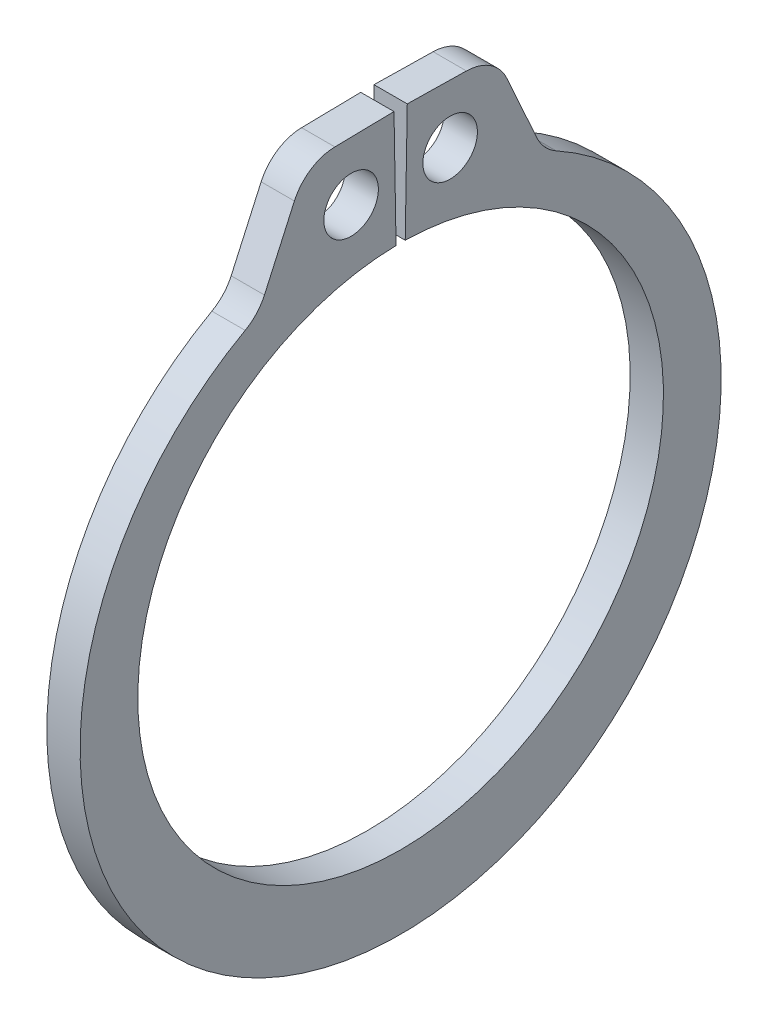
ISO-10303-21;
HEADER;
FILE_DESCRIPTION(('STEP AP214'),'2;1');
FILE_NAME('part.step','',(''),(''),'','','');
FILE_SCHEMA(('AUTOMOTIVE_DESIGN { 1 0 10303 214 1 1 1 1 }'));
ENDSEC;
DATA;
#1=APPLICATION_CONTEXT('core data for automotive mechanical design processes');
#2=APPLICATION_PROTOCOL_DEFINITION('international standard','automotive_design',2000,#1);
#3=PRODUCT_CONTEXT('',#1,'mechanical');
#4=PRODUCT('Part','Part','',(#3));
#5=PRODUCT_RELATED_PRODUCT_CATEGORY('part','',(#4));
#6=PRODUCT_DEFINITION_FORMATION('','',#4);
#7=PRODUCT_DEFINITION_CONTEXT('part definition',#1,'design');
#8=PRODUCT_DEFINITION('design','',#6,#7);
#9=PRODUCT_DEFINITION_SHAPE('','',#8);
#10=(LENGTH_UNIT() NAMED_UNIT(*) SI_UNIT(.MILLI.,.METRE.));
#11=(NAMED_UNIT(*) PLANE_ANGLE_UNIT() SI_UNIT($,.RADIAN.));
#12=(NAMED_UNIT(*) SI_UNIT($,.STERADIAN.) SOLID_ANGLE_UNIT());
#13=UNCERTAINTY_MEASURE_WITH_UNIT(LENGTH_MEASURE(1.E-05),#10,'distance_accuracy_value','');
#14=(GEOMETRIC_REPRESENTATION_CONTEXT(3) GLOBAL_UNCERTAINTY_ASSIGNED_CONTEXT((#13)) GLOBAL_UNIT_ASSIGNED_CONTEXT((#10,
#11,#12)) REPRESENTATION_CONTEXT('',''));
#15=CARTESIAN_POINT('',(0.,0.,0.));
#16=DIRECTION('',(0.,0.,1.));
#17=DIRECTION('',(1.,0.,0.));
#18=AXIS2_PLACEMENT_3D('',#15,#16,#17);
#19=CARTESIAN_POINT('',(-0.3175,0.,0.));
#20=DIRECTION('',(1.,0.,0.));
#21=DIRECTION('',(0.,0.,-1.));
#22=AXIS2_PLACEMENT_3D('',#19,#20,#21);
#23=PLANE('',#22);
#24=CARTESIAN_POINT('',(-0.3175,6.11853713978309,0.945127144407011));
#25=DIRECTION('',(-1.,0.,0.));
#26=DIRECTION('',(0.,0.,1.));
#27=AXIS2_PLACEMENT_3D('',#24,#25,#26);
#28=CIRCLE('',#27,0.5207);
#29=CARTESIAN_POINT('',(-0.3175,6.11853713978309,1.46582714440701));
#30=VERTEX_POINT('',#29);
#31=EDGE_CURVE('E177',#30,#30,#28,.F.);
#32=ORIENTED_EDGE('',*,*,#31,.T.);
#33=EDGE_LOOP('',(#32));
#34=FACE_BOUND('',#33,.T.);
#35=CARTESIAN_POINT('',(-0.3175,6.11853713978309,-0.945127144407011));
#36=DIRECTION('',(-1.,0.,0.));
#37=DIRECTION('',(0.,0.,1.));
#38=AXIS2_PLACEMENT_3D('',#35,#36,#37);
#39=CIRCLE('',#38,0.5207);
#40=CARTESIAN_POINT('',(-0.3175,6.11853713978309,-0.424427144407011));
#41=VERTEX_POINT('',#40);
#42=EDGE_CURVE('E129',#41,#41,#39,.F.);
#43=ORIENTED_EDGE('',*,*,#42,.T.);
#44=EDGE_LOOP('',(#43));
#45=FACE_BOUND('',#44,.T.);
#46=CARTESIAN_POINT('',(-0.3175,6.36742156133207,1.240415062005));
#47=DIRECTION('',(-1.,0.,0.));
#48=DIRECTION('',(0.,0.,1.));
#49=AXIS2_PLACEMENT_3D('',#46,#47,#48);
#50=CIRCLE('',#49,0.8636);
#51=CARTESIAN_POINT('',(-0.3175,7.23089003086913,1.25548696020423));
#52=VERTEX_POINT('',#51);
#53=CARTESIAN_POINT('',(-0.3175,6.72241506955861,2.02767903877327));
#54=VERTEX_POINT('',#53);
#55=EDGE_CURVE('E20',#52,#54,#50,.F.);
#56=ORIENTED_EDGE('',*,*,#55,.F.);
#57=DIRECTION('',(0.,0.0174524064372771,-0.999847695156391));
#58=VECTOR('',#57,1.);
#59=CARTESIAN_POINT('',(-0.3175,7.25059553096561,0.126559615761249));
#60=LINE('',#59,#58);
#61=CARTESIAN_POINT('',(-0.3175,7.25059553096561,0.126559615761249));
#62=VERTEX_POINT('',#61);
#63=EDGE_CURVE('E96',#52,#62,#60,.T.);
#64=ORIENTED_EDGE('',*,*,#63,.T.);
#65=DIRECTION('',(0.,-0.999847695156391,-0.0174524064372835));
#66=VECTOR('',#65,1.);
#67=CARTESIAN_POINT('',(-0.3175,5.01573596275203,0.0875499968926332));
#68=LINE('',#67,#66);
#69=CARTESIAN_POINT('',(-0.3175,5.01573596275203,0.0875499968926332));
#70=VERTEX_POINT('',#69);
#71=EDGE_CURVE('E126',#62,#70,#68,.T.);
#72=ORIENTED_EDGE('',*,*,#71,.T.);
#73=CARTESIAN_POINT('',(-0.3175,0.,0.));
#74=DIRECTION('',(-1.,0.,0.));
#75=DIRECTION('',(0.,0.,1.));
#76=AXIS2_PLACEMENT_3D('',#73,#74,#75);
#77=CIRCLE('',#76,5.0165);
#78=CARTESIAN_POINT('',(-0.3175,5.01573596275204,-0.0875499968926335));
#79=VERTEX_POINT('',#78);
#80=EDGE_CURVE('E139',#70,#79,#77,.F.);
#81=ORIENTED_EDGE('',*,*,#80,.T.);
#82=DIRECTION('',(0.,0.999847695156391,-0.0174524064372835));
#83=VECTOR('',#82,1.);
#84=CARTESIAN_POINT('',(-0.3175,5.01573596275203,-0.0875499968926332));
#85=LINE('',#84,#83);
#86=CARTESIAN_POINT('',(-0.3175,7.25059553096561,-0.126559615761249));
#87=VERTEX_POINT('',#86);
#88=EDGE_CURVE('E136',#79,#87,#85,.T.);
#89=ORIENTED_EDGE('',*,*,#88,.T.);
#90=DIRECTION('',(0.,-0.0174524064372771,-0.999847695156391));
#91=VECTOR('',#90,1.);
#92=CARTESIAN_POINT('',(-0.3175,7.25059553096561,-0.126559615761249));
#93=LINE('',#92,#91);
#94=CARTESIAN_POINT('',(-0.3175,7.23089003086913,-1.25548696020423));
#95=VERTEX_POINT('',#94);
#96=EDGE_CURVE('E143',#87,#95,#93,.T.);
#97=ORIENTED_EDGE('',*,*,#96,.T.);
#98=CARTESIAN_POINT('',(-0.3175,6.36742156133207,-1.240415062005));
#99=DIRECTION('',(-1.,0.,0.));
#100=DIRECTION('',(0.,0.,1.));
#101=AXIS2_PLACEMENT_3D('',#98,#99,#100);
#102=CIRCLE('',#101,0.8636);
#103=CARTESIAN_POINT('',(-0.3175,6.72241506955862,-2.02767903877327));
#104=VERTEX_POINT('',#103);
#105=EDGE_CURVE('E146',#104,#95,#102,.F.);
#106=ORIENTED_EDGE('',*,*,#105,.F.);
#107=DIRECTION('',(0.,-0.911607198666373,-0.411062422680119));
#108=VECTOR('',#107,1.);
#109=CARTESIAN_POINT('',(-0.3175,7.22133831681414,-1.80270429192142));
#110=LINE('',#109,#108);
#111=CARTESIAN_POINT('',(-0.3175,5.45455834354031,-2.59938169554343));
#112=VERTEX_POINT('',#111);
#113=EDGE_CURVE('E149',#104,#112,#110,.T.);
#114=ORIENTED_EDGE('',*,*,#113,.T.);
#115=CARTESIAN_POINT('',(-0.3175,5.80955185176686,-3.38664567231172));
#116=DIRECTION('',(-1.,0.,0.));
#117=DIRECTION('',(0.,0.,1.));
#118=AXIS2_PLACEMENT_3D('',#115,#116,#117);
#119=CIRCLE('',#118,0.8636);
#120=CARTESIAN_POINT('',(-0.3175,5.05436269228527,-2.9677252820208));
#121=VERTEX_POINT('',#120);
#122=EDGE_CURVE('E187',#112,#121,#119,.F.);
#123=ORIENTED_EDGE('',*,*,#122,.T.);
#124=CARTESIAN_POINT('',(-0.3175,-0.295565392488068,0.));
#125=DIRECTION('',(-1.,0.,0.));
#126=DIRECTION('',(0.,0.,1.));
#127=AXIS2_PLACEMENT_3D('',#124,#125,#126);
#128=CIRCLE('',#127,6.11793460751193);
#129=CARTESIAN_POINT('',(-0.3175,5.05436269228528,2.9677252820208));
#130=VERTEX_POINT('',#129);
#131=EDGE_CURVE('E189',#130,#121,#128,.F.);
#132=ORIENTED_EDGE('',*,*,#131,.F.);
#133=CARTESIAN_POINT('',(-0.3175,5.80955185176686,3.38664567231172));
#134=DIRECTION('',(-1.,0.,0.));
#135=DIRECTION('',(0.,0.,1.));
#136=AXIS2_PLACEMENT_3D('',#133,#134,#135);
#137=CIRCLE('',#136,0.8636);
#138=CARTESIAN_POINT('',(-0.3175,5.45455834354031,2.59938169554344));
#139=VERTEX_POINT('',#138);
#140=EDGE_CURVE('E112',#130,#139,#137,.F.);
#141=ORIENTED_EDGE('',*,*,#140,.T.);
#142=DIRECTION('',(0.,0.911607198666373,-0.411062422680119));
#143=VECTOR('',#142,1.);
#144=CARTESIAN_POINT('',(-0.3175,7.22133831681414,1.80270429192142));
#145=LINE('',#144,#143);
#146=EDGE_CURVE('E110',#139,#54,#145,.T.);
#147=ORIENTED_EDGE('',*,*,#146,.T.);
#148=EDGE_LOOP('',(#56,#64,#72,#81,#89,#97,#106,#114,#123,#132,#141,#147));
#149=FACE_BOUND('',#148,.T.);
#150=ADVANCED_FACE('F17',(#34,#45,#149),#23,.F.);
#151=CARTESIAN_POINT('',(0.3175,7.25059553096561,0.126559615761249));
#152=DIRECTION('',(0.,-0.999847695156391,-0.0174524064372771));
#153=DIRECTION('',(0.,0.0174524064372771,-0.999847695156391));
#154=AXIS2_PLACEMENT_3D('',#151,#152,#153);
#155=PLANE('',#154);
#156=DIRECTION('',(-1.,0.,0.));
#157=VECTOR('',#156,1.);
#158=CARTESIAN_POINT('',(0.3175,7.23089003086913,1.25548696020423));
#159=LINE('',#158,#157);
#160=CARTESIAN_POINT('',(0.3175,7.23089003086912,1.25548696020423));
#161=VERTEX_POINT('',#160);
#162=EDGE_CURVE('E107',#161,#52,#159,.T.);
#163=ORIENTED_EDGE('',*,*,#162,.F.);
#164=DIRECTION('',(0.,-0.0174524064372824,0.999847695156391));
#165=VECTOR('',#164,1.);
#166=CARTESIAN_POINT('',(0.3175,7.25059553096561,0.126559615761249));
#167=LINE('',#166,#165);
#168=CARTESIAN_POINT('',(0.3175,7.25059553096561,0.126559615761249));
#169=VERTEX_POINT('',#168);
#170=EDGE_CURVE('E176',#169,#161,#167,.T.);
#171=ORIENTED_EDGE('',*,*,#170,.F.);
#172=DIRECTION('',(1.,0.,0.));
#173=VECTOR('',#172,1.);
#174=CARTESIAN_POINT('',(0.3175,7.25059553096561,0.12655961576125));
#175=LINE('',#174,#173);
#176=EDGE_CURVE('E130',#169,#62,#175,.F.);
#177=ORIENTED_EDGE('',*,*,#176,.T.);
#178=ORIENTED_EDGE('',*,*,#63,.F.);
#179=EDGE_LOOP('',(#163,#171,#177,#178));
#180=FACE_BOUND('',#179,.T.);
#181=ADVANCED_FACE('F237',(#180),#155,.F.);
#182=CARTESIAN_POINT('',(0.3175,6.36742156133207,1.240415062005));
#183=DIRECTION('',(-1.,0.,0.));
#184=DIRECTION('',(0.,0.,1.));
#185=AXIS2_PLACEMENT_3D('',#182,#183,#184);
#186=CYLINDRICAL_SURFACE('',#185,0.8636);
#187=ORIENTED_EDGE('',*,*,#55,.T.);
#188=DIRECTION('',(1.,0.,0.));
#189=VECTOR('',#188,1.);
#190=CARTESIAN_POINT('',(0.3175,6.72241506955861,2.02767903877327));
#191=LINE('',#190,#189);
#192=CARTESIAN_POINT('',(0.3175,6.72241506955861,2.02767903877328));
#193=VERTEX_POINT('',#192);
#194=EDGE_CURVE('E105',#54,#193,#191,.T.);
#195=ORIENTED_EDGE('',*,*,#194,.T.);
#196=CARTESIAN_POINT('',(0.3175,6.36742156133207,1.240415062005));
#197=DIRECTION('',(-1.,0.,0.));
#198=DIRECTION('',(0.,0.,1.));
#199=AXIS2_PLACEMENT_3D('',#196,#197,#198);
#200=CIRCLE('',#199,0.8636);
#201=EDGE_CURVE('E174',#161,#193,#200,.F.);
#202=ORIENTED_EDGE('',*,*,#201,.F.);
#203=ORIENTED_EDGE('',*,*,#162,.T.);
#204=EDGE_LOOP('',(#187,#195,#202,#203));
#205=FACE_BOUND('',#204,.T.);
#206=ADVANCED_FACE('F102',(#205),#186,.T.);
#207=CARTESIAN_POINT('',(0.3175,7.22133831681414,1.80270429192142));
#208=DIRECTION('',(0.,-0.411062422680119,-0.911607198666373));
#209=DIRECTION('',(0.,0.911607198666373,-0.411062422680119));
#210=AXIS2_PLACEMENT_3D('',#207,#208,#209);
#211=PLANE('',#210);
#212=DIRECTION('',(-1.,0.,0.));
#213=VECTOR('',#212,1.);
#214=CARTESIAN_POINT('',(0.3175,5.45455834354031,2.59938169554344));
#215=LINE('',#214,#213);
#216=CARTESIAN_POINT('',(0.3175,5.45455834354031,2.59938169554344));
#217=VERTEX_POINT('',#216);
#218=EDGE_CURVE('E123',#139,#217,#215,.F.);
#219=ORIENTED_EDGE('',*,*,#218,.T.);
#220=DIRECTION('',(0.,-0.911607198666374,0.411062422680115));
#221=VECTOR('',#220,1.);
#222=CARTESIAN_POINT('',(0.3175,6.72241506955862,2.02767903877328));
#223=LINE('',#222,#221);
#224=EDGE_CURVE('E118',#193,#217,#223,.T.);
#225=ORIENTED_EDGE('',*,*,#224,.F.);
#226=ORIENTED_EDGE('',*,*,#194,.F.);
#227=ORIENTED_EDGE('',*,*,#146,.F.);
#228=EDGE_LOOP('',(#219,#225,#226,#227));
#229=FACE_BOUND('',#228,.T.);
#230=ADVANCED_FACE('F116',(#229),#211,.F.);
#231=CARTESIAN_POINT('',(0.3175,5.80955185176686,3.38664567231172));
#232=DIRECTION('',(-1.,0.,0.));
#233=DIRECTION('',(0.,0.,1.));
#234=AXIS2_PLACEMENT_3D('',#231,#232,#233);
#235=CYLINDRICAL_SURFACE('',#234,0.8636);
#236=ORIENTED_EDGE('',*,*,#218,.F.);
#237=ORIENTED_EDGE('',*,*,#140,.F.);
#238=DIRECTION('',(-1.,0.,0.));
#239=VECTOR('',#238,1.);
#240=CARTESIAN_POINT('',(0.3175,5.05436269228528,2.9677252820208));
#241=LINE('',#240,#239);
#242=CARTESIAN_POINT('',(0.3175,5.05436269228528,2.96772528202081));
#243=VERTEX_POINT('',#242);
#244=EDGE_CURVE('E191',#243,#130,#241,.T.);
#245=ORIENTED_EDGE('',*,*,#244,.F.);
#246=CARTESIAN_POINT('',(0.3175,5.80955185176686,3.38664567231172));
#247=DIRECTION('',(-1.,0.,0.));
#248=DIRECTION('',(0.,0.,1.));
#249=AXIS2_PLACEMENT_3D('',#246,#247,#248);
#250=CIRCLE('',#249,0.8636);
#251=EDGE_CURVE('E171',#217,#243,#250,.T.);
#252=ORIENTED_EDGE('',*,*,#251,.F.);
#253=EDGE_LOOP('',(#236,#237,#245,#252));
#254=FACE_BOUND('',#253,.T.);
#255=ADVANCED_FACE('F302',(#254),#235,.F.);
#256=CARTESIAN_POINT('',(0.3175,-0.295565392488068,0.));
#257=DIRECTION('',(-1.,0.,0.));
#258=DIRECTION('',(0.,0.,1.));
#259=AXIS2_PLACEMENT_3D('',#256,#257,#258);
#260=CYLINDRICAL_SURFACE('',#259,6.11793460751193);
#261=ORIENTED_EDGE('',*,*,#131,.T.);
#262=DIRECTION('',(-1.,0.,0.));
#263=VECTOR('',#262,1.);
#264=CARTESIAN_POINT('',(0.3175,5.05436269228528,-2.9677252820208));
#265=LINE('',#264,#263);
#266=CARTESIAN_POINT('',(0.3175,5.05436269228527,-2.9677252820208));
#267=VERTEX_POINT('',#266);
#268=EDGE_CURVE('E151',#121,#267,#265,.F.);
#269=ORIENTED_EDGE('',*,*,#268,.T.);
#270=CARTESIAN_POINT('',(0.3175,-0.295565392488068,0.));
#271=DIRECTION('',(-1.,0.,0.));
#272=DIRECTION('',(0.,0.,1.));
#273=AXIS2_PLACEMENT_3D('',#270,#271,#272);
#274=CIRCLE('',#273,6.11793460751193);
#275=EDGE_CURVE('E168',#243,#267,#274,.F.);
#276=ORIENTED_EDGE('',*,*,#275,.F.);
#277=ORIENTED_EDGE('',*,*,#244,.T.);
#278=EDGE_LOOP('',(#261,#269,#276,#277));
#279=FACE_BOUND('',#278,.T.);
#280=ADVANCED_FACE('F305',(#279),#260,.T.);
#281=CARTESIAN_POINT('',(0.3175,5.80955185176686,-3.38664567231172));
#282=DIRECTION('',(-1.,0.,0.));
#283=DIRECTION('',(0.,0.,1.));
#284=AXIS2_PLACEMENT_3D('',#281,#282,#283);
#285=CYLINDRICAL_SURFACE('',#284,0.8636);
#286=ORIENTED_EDGE('',*,*,#268,.F.);
#287=ORIENTED_EDGE('',*,*,#122,.F.);
#288=DIRECTION('',(1.,0.,0.));
#289=VECTOR('',#288,1.);
#290=CARTESIAN_POINT('',(0.3175,5.45455834354031,-2.59938169554343));
#291=LINE('',#290,#289);
#292=CARTESIAN_POINT('',(0.3175,5.45455834354031,-2.59938169554343));
#293=VERTEX_POINT('',#292);
#294=EDGE_CURVE('E150',#112,#293,#291,.T.);
#295=ORIENTED_EDGE('',*,*,#294,.T.);
#296=CARTESIAN_POINT('',(0.3175,5.80955185176686,-3.38664567231172));
#297=DIRECTION('',(-1.,0.,0.));
#298=DIRECTION('',(0.,0.,1.));
#299=AXIS2_PLACEMENT_3D('',#296,#297,#298);
#300=CIRCLE('',#299,0.8636);
#301=EDGE_CURVE('E165',#267,#293,#300,.T.);
#302=ORIENTED_EDGE('',*,*,#301,.F.);
#303=EDGE_LOOP('',(#286,#287,#295,#302));
#304=FACE_BOUND('',#303,.T.);
#305=ADVANCED_FACE('F309',(#304),#285,.F.);
#306=CARTESIAN_POINT('',(0.3175,7.22133831681414,-1.80270429192142));
#307=DIRECTION('',(0.,-0.411062422680119,0.911607198666373));
#308=DIRECTION('',(0.,-0.911607198666373,-0.411062422680119));
#309=AXIS2_PLACEMENT_3D('',#306,#307,#308);
#310=PLANE('',#309);
#311=ORIENTED_EDGE('',*,*,#294,.F.);
#312=ORIENTED_EDGE('',*,*,#113,.F.);
#313=DIRECTION('',(-1.,0.,0.));
#314=VECTOR('',#313,1.);
#315=CARTESIAN_POINT('',(0.3175,6.72241506955862,-2.02767903877328));
#316=LINE('',#315,#314);
#317=CARTESIAN_POINT('',(0.3175,6.72241506955862,-2.02767903877328));
#318=VERTEX_POINT('',#317);
#319=EDGE_CURVE('E186',#318,#104,#316,.T.);
#320=ORIENTED_EDGE('',*,*,#319,.F.);
#321=DIRECTION('',(0.,0.911607198666374,0.411062422680115));
#322=VECTOR('',#321,1.);
#323=CARTESIAN_POINT('',(0.3175,5.45455834354031,-2.59938169554343));
#324=LINE('',#323,#322);
#325=EDGE_CURVE('E164',#293,#318,#324,.T.);
#326=ORIENTED_EDGE('',*,*,#325,.F.);
#327=EDGE_LOOP('',(#311,#312,#320,#326));
#328=FACE_BOUND('',#327,.T.);
#329=ADVANCED_FACE('F312',(#328),#310,.F.);
#330=CARTESIAN_POINT('',(0.3175,6.36742156133207,-1.240415062005));
#331=DIRECTION('',(-1.,0.,0.));
#332=DIRECTION('',(0.,0.,1.));
#333=AXIS2_PLACEMENT_3D('',#330,#331,#332);
#334=CYLINDRICAL_SURFACE('',#333,0.8636);
#335=ORIENTED_EDGE('',*,*,#105,.T.);
#336=DIRECTION('',(1.,0.,0.));
#337=VECTOR('',#336,1.);
#338=CARTESIAN_POINT('',(0.3175,7.23089003086913,-1.25548696020423));
#339=LINE('',#338,#337);
#340=CARTESIAN_POINT('',(0.3175,7.23089003086912,-1.25548696020423));
#341=VERTEX_POINT('',#340);
#342=EDGE_CURVE('E145',#95,#341,#339,.T.);
#343=ORIENTED_EDGE('',*,*,#342,.T.);
#344=CARTESIAN_POINT('',(0.3175,6.36742156133207,-1.240415062005));
#345=DIRECTION('',(-1.,0.,0.));
#346=DIRECTION('',(0.,0.,1.));
#347=AXIS2_PLACEMENT_3D('',#344,#345,#346);
#348=CIRCLE('',#347,0.8636);
#349=EDGE_CURVE('E160',#318,#341,#348,.F.);
#350=ORIENTED_EDGE('',*,*,#349,.F.);
#351=ORIENTED_EDGE('',*,*,#319,.T.);
#352=EDGE_LOOP('',(#335,#343,#350,#351));
#353=FACE_BOUND('',#352,.T.);
#354=ADVANCED_FACE('F254',(#353),#334,.T.);
#355=CARTESIAN_POINT('',(0.3175,7.25059553096561,-0.126559615761249));
#356=DIRECTION('',(0.,-0.999847695156391,0.0174524064372771));
#357=DIRECTION('',(0.,-0.0174524064372771,-0.999847695156391));
#358=AXIS2_PLACEMENT_3D('',#355,#356,#357);
#359=PLANE('',#358);
#360=ORIENTED_EDGE('',*,*,#342,.F.);
#361=ORIENTED_EDGE('',*,*,#96,.F.);
#362=DIRECTION('',(1.,0.,0.));
#363=VECTOR('',#362,1.);
#364=CARTESIAN_POINT('',(0.3175,7.25059553096561,-0.12655961576125));
#365=LINE('',#364,#363);
#366=CARTESIAN_POINT('',(0.3175,7.25059553096561,-0.126559615761249));
#367=VERTEX_POINT('',#366);
#368=EDGE_CURVE('E140',#87,#367,#365,.T.);
#369=ORIENTED_EDGE('',*,*,#368,.T.);
#370=DIRECTION('',(0.,0.0174524064372824,0.999847695156391));
#371=VECTOR('',#370,1.);
#372=CARTESIAN_POINT('',(0.3175,7.23089003086912,-1.25548696020423));
#373=LINE('',#372,#371);
#374=EDGE_CURVE('E163',#341,#367,#373,.T.);
#375=ORIENTED_EDGE('',*,*,#374,.F.);
#376=EDGE_LOOP('',(#360,#361,#369,#375));
#377=FACE_BOUND('',#376,.T.);
#378=ADVANCED_FACE('F246',(#377),#359,.F.);
#379=CARTESIAN_POINT('',(0.3175,5.01573596275203,-0.0875499968926332));
#380=DIRECTION('',(0.,-0.0174524064372835,-0.999847695156391));
#381=DIRECTION('',(0.,0.999847695156391,-0.0174524064372835));
#382=AXIS2_PLACEMENT_3D('',#379,#380,#381);
#383=PLANE('',#382);
#384=DIRECTION('',(-1.,0.,0.));
#385=VECTOR('',#384,1.);
#386=CARTESIAN_POINT('',(0.3175,5.01573596275204,-0.0875499968926337));
#387=LINE('',#386,#385);
#388=CARTESIAN_POINT('',(0.3175,5.01573596275204,-0.0875499968926334));
#389=VERTEX_POINT('',#388);
#390=EDGE_CURVE('E183',#79,#389,#387,.F.);
#391=ORIENTED_EDGE('',*,*,#390,.T.);
#392=DIRECTION('',(0.,-0.999847695156391,0.0174524064372834));
#393=VECTOR('',#392,1.);
#394=CARTESIAN_POINT('',(0.3175,7.25059553096561,-0.126559615761249));
#395=LINE('',#394,#393);
#396=EDGE_CURVE('E159',#367,#389,#395,.T.);
#397=ORIENTED_EDGE('',*,*,#396,.F.);
#398=ORIENTED_EDGE('',*,*,#368,.F.);
#399=ORIENTED_EDGE('',*,*,#88,.F.);
#400=EDGE_LOOP('',(#391,#397,#398,#399));
#401=FACE_BOUND('',#400,.T.);
#402=ADVANCED_FACE('F249',(#401),#383,.F.);
#403=CARTESIAN_POINT('',(0.3175,0.,0.));
#404=DIRECTION('',(-1.,0.,0.));
#405=DIRECTION('',(0.,0.,1.));
#406=AXIS2_PLACEMENT_3D('',#403,#404,#405);
#407=CYLINDRICAL_SURFACE('',#406,5.0165);
#408=ORIENTED_EDGE('',*,*,#390,.F.);
#409=ORIENTED_EDGE('',*,*,#80,.F.);
#410=DIRECTION('',(1.,0.,0.));
#411=VECTOR('',#410,1.);
#412=CARTESIAN_POINT('',(0.3175,5.01573596275203,0.0875499968926332));
#413=LINE('',#412,#411);
#414=CARTESIAN_POINT('',(0.3175,5.01573596275203,0.0875499968926332));
#415=VERTEX_POINT('',#414);
#416=EDGE_CURVE('E35',#70,#415,#413,.T.);
#417=ORIENTED_EDGE('',*,*,#416,.T.);
#418=CARTESIAN_POINT('',(0.3175,0.,0.));
#419=DIRECTION('',(-1.,0.,0.));
#420=DIRECTION('',(0.,0.,1.));
#421=AXIS2_PLACEMENT_3D('',#418,#419,#420);
#422=CIRCLE('',#421,5.0165);
#423=EDGE_CURVE('E156',#389,#415,#422,.T.);
#424=ORIENTED_EDGE('',*,*,#423,.F.);
#425=EDGE_LOOP('',(#408,#409,#417,#424));
#426=FACE_BOUND('',#425,.T.);
#427=ADVANCED_FACE('F257',(#426),#407,.F.);
#428=CARTESIAN_POINT('',(0.3175,5.01573596275203,0.0875499968926332));
#429=DIRECTION('',(0.,-0.0174524064372835,0.999847695156391));
#430=DIRECTION('',(0.,-0.999847695156391,-0.0174524064372835));
#431=AXIS2_PLACEMENT_3D('',#428,#429,#430);
#432=PLANE('',#431);
#433=ORIENTED_EDGE('',*,*,#176,.F.);
#434=DIRECTION('',(0.,0.999847695156391,0.0174524064372834));
#435=VECTOR('',#434,1.);
#436=CARTESIAN_POINT('',(0.3175,5.01573596275203,0.0875499968926332));
#437=LINE('',#436,#435);
#438=EDGE_CURVE('E155',#415,#169,#437,.T.);
#439=ORIENTED_EDGE('',*,*,#438,.F.);
#440=ORIENTED_EDGE('',*,*,#416,.F.);
#441=ORIENTED_EDGE('',*,*,#71,.F.);
#442=EDGE_LOOP('',(#433,#439,#440,#441));
#443=FACE_BOUND('',#442,.T.);
#444=ADVANCED_FACE('F235',(#443),#432,.F.);
#445=CARTESIAN_POINT('',(0.3175,6.11853713978309,-0.945127144407011));
#446=DIRECTION('',(-1.,0.,0.));
#447=DIRECTION('',(0.,0.,1.));
#448=AXIS2_PLACEMENT_3D('',#445,#446,#447);
#449=CYLINDRICAL_SURFACE('',#448,0.5207);
#450=ORIENTED_EDGE('',*,*,#42,.F.);
#451=EDGE_LOOP('',(#450));
#452=FACE_BOUND('',#451,.T.);
#453=CARTESIAN_POINT('',(0.3175,6.11853713978309,-0.945127144407011));
#454=DIRECTION('',(-1.,0.,0.));
#455=DIRECTION('',(0.,0.,1.));
#456=AXIS2_PLACEMENT_3D('',#453,#454,#455);
#457=CIRCLE('',#456,0.5207);
#458=CARTESIAN_POINT('',(0.3175,6.11853713978309,-0.424427144407011));
#459=VERTEX_POINT('',#458);
#460=EDGE_CURVE('E26',#459,#459,#457,.T.);
#461=ORIENTED_EDGE('',*,*,#460,.F.);
#462=EDGE_LOOP('',(#461));
#463=FACE_BOUND('',#462,.T.);
#464=ADVANCED_FACE('F265',(#452,#463),#449,.F.);
#465=CARTESIAN_POINT('',(0.3175,6.11853713978309,0.945127144407011));
#466=DIRECTION('',(-1.,0.,0.));
#467=DIRECTION('',(0.,0.,1.));
#468=AXIS2_PLACEMENT_3D('',#465,#466,#467);
#469=CYLINDRICAL_SURFACE('',#468,0.5207);
#470=ORIENTED_EDGE('',*,*,#31,.F.);
#471=EDGE_LOOP('',(#470));
#472=FACE_BOUND('',#471,.T.);
#473=CARTESIAN_POINT('',(0.3175,6.11853713978309,0.945127144407011));
#474=DIRECTION('',(-1.,0.,0.));
#475=DIRECTION('',(0.,0.,1.));
#476=AXIS2_PLACEMENT_3D('',#473,#474,#475);
#477=CIRCLE('',#476,0.5207);
#478=CARTESIAN_POINT('',(0.3175,6.11853713978309,1.46582714440701));
#479=VERTEX_POINT('',#478);
#480=EDGE_CURVE('E11',#479,#479,#477,.T.);
#481=ORIENTED_EDGE('',*,*,#480,.F.);
#482=EDGE_LOOP('',(#481));
#483=FACE_BOUND('',#482,.T.);
#484=ADVANCED_FACE('F269',(#472,#483),#469,.F.);
#485=CARTESIAN_POINT('',(0.3175,0.,0.));
#486=DIRECTION('',(1.,0.,0.));
#487=DIRECTION('',(0.,0.,-1.));
#488=AXIS2_PLACEMENT_3D('',#485,#486,#487);
#489=PLANE('',#488);
#490=ORIENTED_EDGE('',*,*,#480,.T.);
#491=EDGE_LOOP('',(#490));
#492=FACE_BOUND('',#491,.T.);
#493=ORIENTED_EDGE('',*,*,#460,.T.);
#494=EDGE_LOOP('',(#493));
#495=FACE_BOUND('',#494,.T.);
#496=ORIENTED_EDGE('',*,*,#423,.T.);
#497=ORIENTED_EDGE('',*,*,#438,.T.);
#498=ORIENTED_EDGE('',*,*,#170,.T.);
#499=ORIENTED_EDGE('',*,*,#201,.T.);
#500=ORIENTED_EDGE('',*,*,#224,.T.);
#501=ORIENTED_EDGE('',*,*,#251,.T.);
#502=ORIENTED_EDGE('',*,*,#275,.T.);
#503=ORIENTED_EDGE('',*,*,#301,.T.);
#504=ORIENTED_EDGE('',*,*,#325,.T.);
#505=ORIENTED_EDGE('',*,*,#349,.T.);
#506=ORIENTED_EDGE('',*,*,#374,.T.);
#507=ORIENTED_EDGE('',*,*,#396,.T.);
#508=EDGE_LOOP('',(#496,#497,#498,#499,#500,#501,#502,#503,#504,#505,#506,#507));
#509=FACE_BOUND('',#508,.T.);
#510=ADVANCED_FACE('F230',(#492,#495,#509),#489,.T.);
#511=CLOSED_SHELL('',(#150,#181,#206,#230,#255,#280,#305,#329,#354,#378,#402,#427,#444,#464,
#484,#510));
#512=MANIFOLD_SOLID_BREP('B1',#511);
#513=ADVANCED_BREP_SHAPE_REPRESENTATION('',(#18,#512),#14);
#514=SHAPE_DEFINITION_REPRESENTATION(#9,#513);
ENDSEC;
END-ISO-10303-21;
